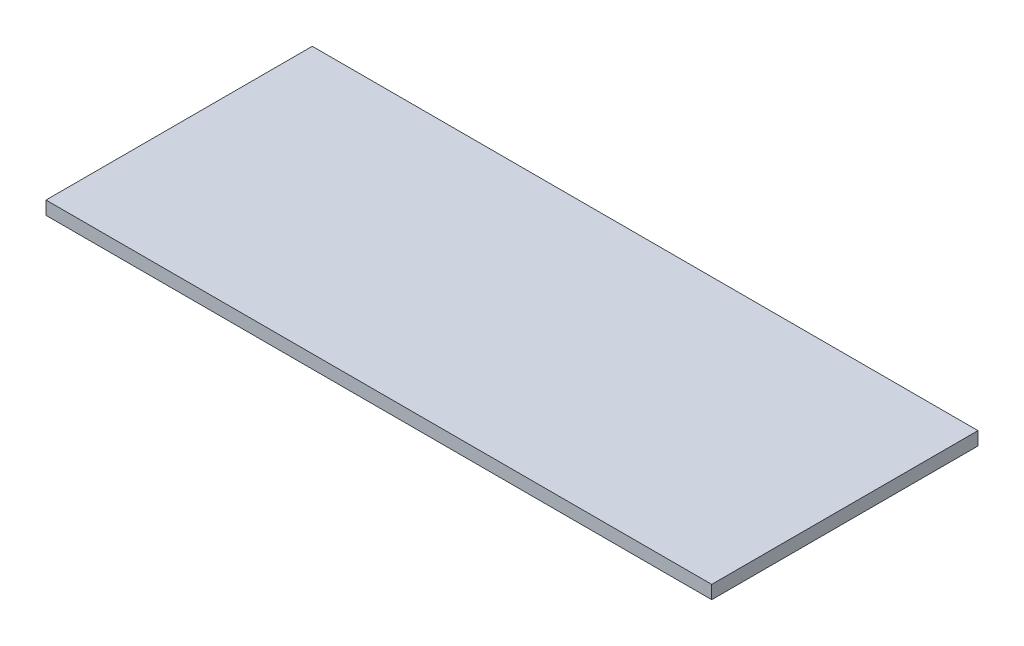
ISO-10303-21;
HEADER;
FILE_DESCRIPTION(('STEP AP214'),'2;1');
FILE_NAME('part.step','',(''),(''),'','','');
FILE_SCHEMA(('AUTOMOTIVE_DESIGN { 1 0 10303 214 1 1 1 1 }'));
ENDSEC;
DATA;
#1=APPLICATION_CONTEXT('core data for automotive mechanical design processes');
#2=APPLICATION_PROTOCOL_DEFINITION('international standard','automotive_design',2000,#1);
#3=PRODUCT_CONTEXT('',#1,'mechanical');
#4=PRODUCT('Part','Part','',(#3));
#5=PRODUCT_RELATED_PRODUCT_CATEGORY('part','',(#4));
#6=PRODUCT_DEFINITION_FORMATION('','',#4);
#7=PRODUCT_DEFINITION_CONTEXT('part definition',#1,'design');
#8=PRODUCT_DEFINITION('design','',#6,#7);
#9=PRODUCT_DEFINITION_SHAPE('','',#8);
#10=(LENGTH_UNIT() NAMED_UNIT(*) SI_UNIT(.MILLI.,.METRE.));
#11=(NAMED_UNIT(*) PLANE_ANGLE_UNIT() SI_UNIT($,.RADIAN.));
#12=(NAMED_UNIT(*) SI_UNIT($,.STERADIAN.) SOLID_ANGLE_UNIT());
#13=UNCERTAINTY_MEASURE_WITH_UNIT(LENGTH_MEASURE(1.E-05),#10,'distance_accuracy_value','');
#14=(GEOMETRIC_REPRESENTATION_CONTEXT(3) GLOBAL_UNCERTAINTY_ASSIGNED_CONTEXT((#13)) GLOBAL_UNIT_ASSIGNED_CONTEXT((#10,
#11,#12)) REPRESENTATION_CONTEXT('',''));
#15=CARTESIAN_POINT('',(0.,0.,0.));
#16=DIRECTION('',(0.,0.,1.));
#17=DIRECTION('',(1.,0.,0.));
#18=AXIS2_PLACEMENT_3D('',#15,#16,#17);
#19=CARTESIAN_POINT('',(1250.,50.,-500.));
#20=DIRECTION('',(-1.,0.,0.));
#21=DIRECTION('',(0.,0.,1.));
#22=AXIS2_PLACEMENT_3D('',#19,#20,#21);
#23=PLANE('',#22);
#24=DIRECTION('',(0.,0.,-1.));
#25=VECTOR('',#24,1.);
#26=CARTESIAN_POINT('',(1250.,0.,-500.));
#27=LINE('',#26,#25);
#28=CARTESIAN_POINT('',(1250.,0.,500.));
#29=VERTEX_POINT('',#28);
#30=CARTESIAN_POINT('',(1250.,0.,-500.));
#31=VERTEX_POINT('',#30);
#32=EDGE_CURVE('E107',#29,#31,#27,.T.);
#33=ORIENTED_EDGE('',*,*,#32,.T.);
#34=DIRECTION('',(0.,-1.,0.));
#35=VECTOR('',#34,1.);
#36=CARTESIAN_POINT('',(1250.,50.,-500.));
#37=LINE('',#36,#35);
#38=CARTESIAN_POINT('',(1250.,50.,-500.));
#39=VERTEX_POINT('',#38);
#40=EDGE_CURVE('E11',#39,#31,#37,.T.);
#41=ORIENTED_EDGE('',*,*,#40,.F.);
#42=DIRECTION('',(0.,0.,-1.));
#43=VECTOR('',#42,1.);
#44=CARTESIAN_POINT('',(1250.,50.,-500.));
#45=LINE('',#44,#43);
#46=CARTESIAN_POINT('',(1250.,50.,500.));
#47=VERTEX_POINT('',#46);
#48=EDGE_CURVE('E91',#47,#39,#45,.T.);
#49=ORIENTED_EDGE('',*,*,#48,.F.);
#50=DIRECTION('',(0.,-1.,0.));
#51=VECTOR('',#50,1.);
#52=CARTESIAN_POINT('',(1250.,50.,500.));
#53=LINE('',#52,#51);
#54=EDGE_CURVE('E103',#47,#29,#53,.T.);
#55=ORIENTED_EDGE('',*,*,#54,.T.);
#56=EDGE_LOOP('',(#33,#41,#49,#55));
#57=FACE_BOUND('',#56,.T.);
#58=ADVANCED_FACE('F39',(#57),#23,.F.);
#59=CARTESIAN_POINT('',(-1250.,50.,-500.));
#60=DIRECTION('',(0.,0.,1.));
#61=DIRECTION('',(1.,0.,0.));
#62=AXIS2_PLACEMENT_3D('',#59,#60,#61);
#63=PLANE('',#62);
#64=DIRECTION('',(-1.,0.,0.));
#65=VECTOR('',#64,1.);
#66=CARTESIAN_POINT('',(-1250.,0.,-500.));
#67=LINE('',#66,#65);
#68=CARTESIAN_POINT('',(-1250.,0.,-500.));
#69=VERTEX_POINT('',#68);
#70=EDGE_CURVE('E96',#31,#69,#67,.T.);
#71=ORIENTED_EDGE('',*,*,#70,.T.);
#72=DIRECTION('',(0.,-1.,0.));
#73=VECTOR('',#72,1.);
#74=CARTESIAN_POINT('',(-1250.,50.,-500.));
#75=LINE('',#74,#73);
#76=CARTESIAN_POINT('',(-1250.,50.,-500.));
#77=VERTEX_POINT('',#76);
#78=EDGE_CURVE('E48',#77,#69,#75,.T.);
#79=ORIENTED_EDGE('',*,*,#78,.F.);
#80=DIRECTION('',(-1.,0.,0.));
#81=VECTOR('',#80,1.);
#82=CARTESIAN_POINT('',(-1250.,50.,-500.));
#83=LINE('',#82,#81);
#84=EDGE_CURVE('E86',#39,#77,#83,.T.);
#85=ORIENTED_EDGE('',*,*,#84,.F.);
#86=ORIENTED_EDGE('',*,*,#40,.T.);
#87=EDGE_LOOP('',(#71,#79,#85,#86));
#88=FACE_BOUND('',#87,.T.);
#89=ADVANCED_FACE('F95',(#88),#63,.F.);
#90=CARTESIAN_POINT('',(-1250.,50.,-500.));
#91=DIRECTION('',(1.,0.,0.));
#92=DIRECTION('',(0.,0.,-1.));
#93=AXIS2_PLACEMENT_3D('',#90,#91,#92);
#94=PLANE('',#93);
#95=DIRECTION('',(0.,0.,1.));
#96=VECTOR('',#95,1.);
#97=CARTESIAN_POINT('',(-1250.,0.,-500.));
#98=LINE('',#97,#96);
#99=CARTESIAN_POINT('',(-1250.,0.,500.));
#100=VERTEX_POINT('',#99);
#101=EDGE_CURVE('E73',#69,#100,#98,.T.);
#102=ORIENTED_EDGE('',*,*,#101,.T.);
#103=DIRECTION('',(0.,-1.,0.));
#104=VECTOR('',#103,1.);
#105=CARTESIAN_POINT('',(-1250.,50.,500.));
#106=LINE('',#105,#104);
#107=CARTESIAN_POINT('',(-1250.,50.,500.));
#108=VERTEX_POINT('',#107);
#109=EDGE_CURVE('E98',#108,#100,#106,.T.);
#110=ORIENTED_EDGE('',*,*,#109,.F.);
#111=DIRECTION('',(0.,0.,1.));
#112=VECTOR('',#111,1.);
#113=CARTESIAN_POINT('',(-1250.,50.,-500.));
#114=LINE('',#113,#112);
#115=EDGE_CURVE('E89',#77,#108,#114,.T.);
#116=ORIENTED_EDGE('',*,*,#115,.F.);
#117=ORIENTED_EDGE('',*,*,#78,.T.);
#118=EDGE_LOOP('',(#102,#110,#116,#117));
#119=FACE_BOUND('',#118,.T.);
#120=ADVANCED_FACE('F99',(#119),#94,.F.);
#121=CARTESIAN_POINT('',(-1250.,50.,500.));
#122=DIRECTION('',(0.,0.,-1.));
#123=DIRECTION('',(-1.,0.,0.));
#124=AXIS2_PLACEMENT_3D('',#121,#122,#123);
#125=PLANE('',#124);
#126=DIRECTION('',(1.,0.,0.));
#127=VECTOR('',#126,1.);
#128=CARTESIAN_POINT('',(-1250.,0.,500.));
#129=LINE('',#128,#127);
#130=EDGE_CURVE('E79',#100,#29,#129,.T.);
#131=ORIENTED_EDGE('',*,*,#130,.T.);
#132=ORIENTED_EDGE('',*,*,#54,.F.);
#133=DIRECTION('',(1.,0.,0.));
#134=VECTOR('',#133,1.);
#135=CARTESIAN_POINT('',(-1250.,50.,500.));
#136=LINE('',#135,#134);
#137=EDGE_CURVE('E56',#108,#47,#136,.T.);
#138=ORIENTED_EDGE('',*,*,#137,.F.);
#139=ORIENTED_EDGE('',*,*,#109,.T.);
#140=EDGE_LOOP('',(#131,#132,#138,#139));
#141=FACE_BOUND('',#140,.T.);
#142=ADVANCED_FACE('F120',(#141),#125,.F.);
#143=CARTESIAN_POINT('',(0.,50.,0.));
#144=DIRECTION('',(0.,1.,0.));
#145=DIRECTION('',(0.,0.,1.));
#146=AXIS2_PLACEMENT_3D('',#143,#144,#145);
#147=PLANE('',#146);
#148=ORIENTED_EDGE('',*,*,#48,.T.);
#149=ORIENTED_EDGE('',*,*,#84,.T.);
#150=ORIENTED_EDGE('',*,*,#115,.T.);
#151=ORIENTED_EDGE('',*,*,#137,.T.);
#152=EDGE_LOOP('',(#148,#149,#150,#151));
#153=FACE_BOUND('',#152,.T.);
#154=ADVANCED_FACE('F87',(#153),#147,.T.);
#155=CARTESIAN_POINT('',(0.,0.,0.));
#156=DIRECTION('',(0.,1.,0.));
#157=DIRECTION('',(0.,0.,1.));
#158=AXIS2_PLACEMENT_3D('',#155,#156,#157);
#159=PLANE('',#158);
#160=ORIENTED_EDGE('',*,*,#32,.F.);
#161=ORIENTED_EDGE('',*,*,#130,.F.);
#162=ORIENTED_EDGE('',*,*,#101,.F.);
#163=ORIENTED_EDGE('',*,*,#70,.F.);
#164=EDGE_LOOP('',(#160,#161,#162,#163));
#165=FACE_BOUND('',#164,.T.);
#166=ADVANCED_FACE('F123',(#165),#159,.F.);
#167=CLOSED_SHELL('',(#58,#89,#120,#142,#154,#166));
#168=MANIFOLD_SOLID_BREP('B2',#167);
#169=ADVANCED_BREP_SHAPE_REPRESENTATION('',(#18,#168),#14);
#170=SHAPE_DEFINITION_REPRESENTATION(#9,#169);
ENDSEC;
END-ISO-10303-21;
